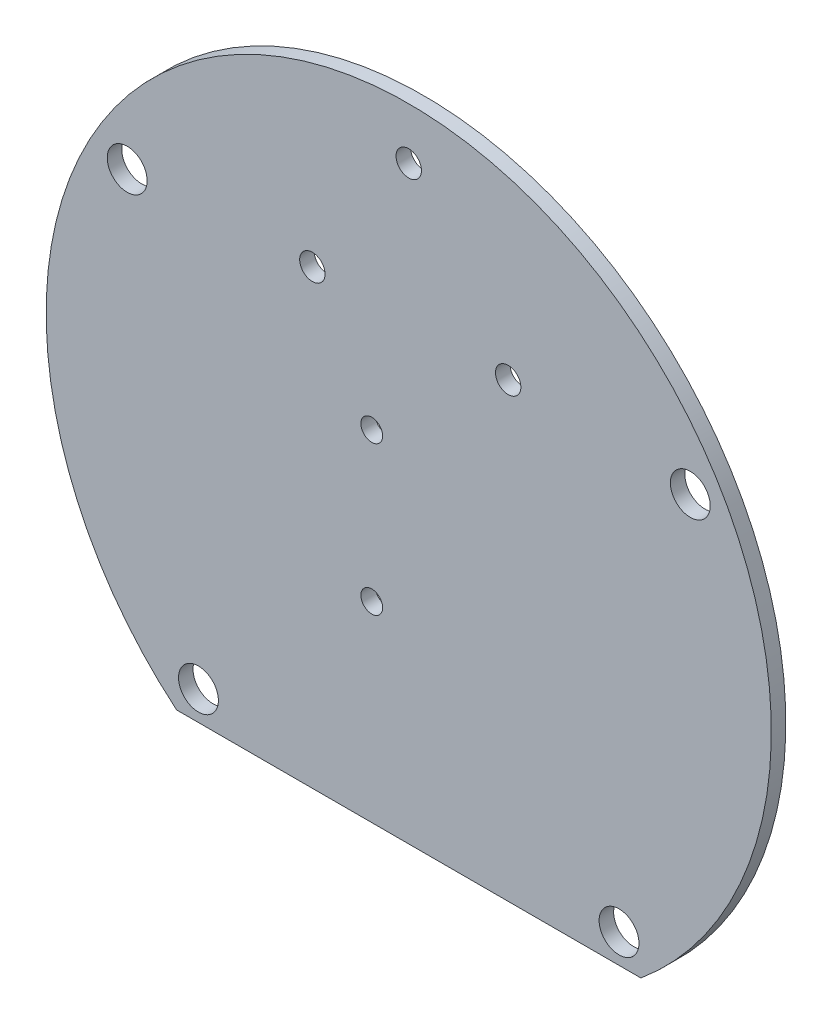
ISO-10303-21;
HEADER;
FILE_DESCRIPTION(('STEP AP214'),'2;1');
FILE_NAME('part.step','',(''),(''),'','','');
FILE_SCHEMA(('AUTOMOTIVE_DESIGN { 1 0 10303 214 1 1 1 1 }'));
ENDSEC;
DATA;
#1=APPLICATION_CONTEXT('core data for automotive mechanical design processes');
#2=APPLICATION_PROTOCOL_DEFINITION('international standard','automotive_design',2000,#1);
#3=PRODUCT_CONTEXT('',#1,'mechanical');
#4=PRODUCT('Part','Part','',(#3));
#5=PRODUCT_RELATED_PRODUCT_CATEGORY('part','',(#4));
#6=PRODUCT_DEFINITION_FORMATION('','',#4);
#7=PRODUCT_DEFINITION_CONTEXT('part definition',#1,'design');
#8=PRODUCT_DEFINITION('design','',#6,#7);
#9=PRODUCT_DEFINITION_SHAPE('','',#8);
#10=(LENGTH_UNIT() NAMED_UNIT(*) SI_UNIT(.MILLI.,.METRE.));
#11=(NAMED_UNIT(*) PLANE_ANGLE_UNIT() SI_UNIT($,.RADIAN.));
#12=(NAMED_UNIT(*) SI_UNIT($,.STERADIAN.) SOLID_ANGLE_UNIT());
#13=UNCERTAINTY_MEASURE_WITH_UNIT(LENGTH_MEASURE(1.E-05),#10,'distance_accuracy_value','');
#14=(GEOMETRIC_REPRESENTATION_CONTEXT(3) GLOBAL_UNCERTAINTY_ASSIGNED_CONTEXT((#13)) GLOBAL_UNIT_ASSIGNED_CONTEXT((#10,
#11,#12)) REPRESENTATION_CONTEXT('',''));
#15=CARTESIAN_POINT('',(0.,0.,0.));
#16=DIRECTION('',(0.,0.,1.));
#17=DIRECTION('',(1.,0.,0.));
#18=AXIS2_PLACEMENT_3D('',#15,#16,#17);
#19=CARTESIAN_POINT('',(0.,0.,2.));
#20=DIRECTION('',(0.,0.,-1.));
#21=DIRECTION('',(-1.,0.,0.));
#22=AXIS2_PLACEMENT_3D('',#19,#20,#21);
#23=CYLINDRICAL_SURFACE('',#22,50.);
#24=DIRECTION('',(0.,0.,-1.));
#25=VECTOR('',#24,1.);
#26=CARTESIAN_POINT('',(-32.0113353588168,-38.4093010681705,2.));
#27=LINE('',#26,#25);
#28=CARTESIAN_POINT('',(-32.0113353588168,-38.4093010681705,2.));
#29=VERTEX_POINT('',#28);
#30=CARTESIAN_POINT('',(-32.0113353588168,-38.4093010681705,0.));
#31=VERTEX_POINT('',#30);
#32=EDGE_CURVE('E55',#29,#31,#27,.T.);
#33=ORIENTED_EDGE('',*,*,#32,.F.);
#34=CARTESIAN_POINT('',(0.,0.,2.));
#35=DIRECTION('',(0.,0.,1.));
#36=DIRECTION('',(1.,0.,0.));
#37=AXIS2_PLACEMENT_3D('',#34,#35,#36);
#38=CIRCLE('',#37,50.);
#39=CARTESIAN_POINT('',(32.0113353588168,-38.4093010681705,2.));
#40=VERTEX_POINT('',#39);
#41=EDGE_CURVE('E49',#40,#29,#38,.T.);
#42=ORIENTED_EDGE('',*,*,#41,.F.);
#43=DIRECTION('',(0.,0.,-1.));
#44=VECTOR('',#43,1.);
#45=CARTESIAN_POINT('',(32.0113353588168,-38.4093010681705,2.));
#46=LINE('',#45,#44);
#47=CARTESIAN_POINT('',(32.0113353588168,-38.4093010681705,0.));
#48=VERTEX_POINT('',#47);
#49=EDGE_CURVE('E66',#48,#40,#46,.F.);
#50=ORIENTED_EDGE('',*,*,#49,.F.);
#51=CARTESIAN_POINT('',(0.,0.,0.));
#52=DIRECTION('',(0.,0.,1.));
#53=DIRECTION('',(1.,0.,0.));
#54=AXIS2_PLACEMENT_3D('',#51,#52,#53);
#55=CIRCLE('',#54,50.);
#56=EDGE_CURVE('E72',#48,#31,#55,.T.);
#57=ORIENTED_EDGE('',*,*,#56,.T.);
#58=EDGE_LOOP('',(#33,#42,#50,#57));
#59=FACE_BOUND('',#58,.T.);
#60=ADVANCED_FACE('F41',(#59),#23,.T.);
#61=CARTESIAN_POINT('',(0.,0.,2.));
#62=DIRECTION('',(0.,0.,1.));
#63=DIRECTION('',(1.,0.,0.));
#64=AXIS2_PLACEMENT_3D('',#61,#62,#63);
#65=PLANE('',#64);
#66=CARTESIAN_POINT('',(-5.09999999999999,-12.,2.));
#67=DIRECTION('',(0.,0.,1.));
#68=DIRECTION('',(1.,0.,0.));
#69=AXIS2_PLACEMENT_3D('',#66,#67,#68);
#70=CIRCLE('',#69,1.5);
#71=CARTESIAN_POINT('',(-3.59999999999999,-12.,2.));
#72=VERTEX_POINT('',#71);
#73=EDGE_CURVE('E75',#72,#72,#70,.T.);
#74=ORIENTED_EDGE('',*,*,#73,.F.);
#75=EDGE_LOOP('',(#74));
#76=FACE_BOUND('',#75,.T.);
#77=CARTESIAN_POINT('',(13.71,23.86,2.));
#78=DIRECTION('',(0.,0.,1.));
#79=DIRECTION('',(1.,0.,0.));
#80=AXIS2_PLACEMENT_3D('',#77,#78,#79);
#81=CIRCLE('',#80,1.75);
#82=CARTESIAN_POINT('',(15.46,23.86,2.));
#83=VERTEX_POINT('',#82);
#84=EDGE_CURVE('E121',#83,#83,#81,.T.);
#85=ORIENTED_EDGE('',*,*,#84,.F.);
#86=EDGE_LOOP('',(#85));
#87=FACE_BOUND('',#86,.T.);
#88=CARTESIAN_POINT('',(-13.29,23.86,2.));
#89=DIRECTION('',(0.,0.,1.));
#90=DIRECTION('',(1.,0.,0.));
#91=AXIS2_PLACEMENT_3D('',#88,#89,#90);
#92=CIRCLE('',#91,1.75);
#93=CARTESIAN_POINT('',(-11.54,23.86,2.));
#94=VERTEX_POINT('',#93);
#95=EDGE_CURVE('E125',#94,#94,#92,.T.);
#96=ORIENTED_EDGE('',*,*,#95,.F.);
#97=EDGE_LOOP('',(#96));
#98=FACE_BOUND('',#97,.T.);
#99=CARTESIAN_POINT('',(0.,42.87,2.));
#100=DIRECTION('',(0.,0.,1.));
#101=DIRECTION('',(1.,0.,0.));
#102=AXIS2_PLACEMENT_3D('',#99,#100,#101);
#103=CIRCLE('',#102,1.75);
#104=CARTESIAN_POINT('',(1.75,42.87,2.));
#105=VERTEX_POINT('',#104);
#106=EDGE_CURVE('E129',#105,#105,#103,.T.);
#107=ORIENTED_EDGE('',*,*,#106,.F.);
#108=EDGE_LOOP('',(#107));
#109=FACE_BOUND('',#108,.T.);
#110=CARTESIAN_POINT('',(-5.09999999999999,8.49999999999999,2.));
#111=DIRECTION('',(0.,0.,1.));
#112=DIRECTION('',(1.,0.,0.));
#113=AXIS2_PLACEMENT_3D('',#110,#111,#112);
#114=CIRCLE('',#113,1.5);
#115=CARTESIAN_POINT('',(-3.59999999999999,8.49999999999999,2.));
#116=VERTEX_POINT('',#115);
#117=EDGE_CURVE('E133',#116,#116,#114,.T.);
#118=ORIENTED_EDGE('',*,*,#117,.F.);
#119=EDGE_LOOP('',(#118));
#120=FACE_BOUND('',#119,.T.);
#121=CARTESIAN_POINT('',(38.8241975308642,22.7526193235952,2.));
#122=DIRECTION('',(0.,0.,1.));
#123=DIRECTION('',(1.,0.,0.));
#124=AXIS2_PLACEMENT_3D('',#121,#122,#123);
#125=CIRCLE('',#124,2.75);
#126=CARTESIAN_POINT('',(41.5741975308642,22.7526193235952,2.));
#127=VERTEX_POINT('',#126);
#128=EDGE_CURVE('E91',#127,#127,#125,.T.);
#129=ORIENTED_EDGE('',*,*,#128,.F.);
#130=EDGE_LOOP('',(#129));
#131=FACE_BOUND('',#130,.T.);
#132=CARTESIAN_POINT('',(-38.8241975308642,22.7526193235952,2.));
#133=DIRECTION('',(0.,0.,1.));
#134=DIRECTION('',(1.,0.,0.));
#135=AXIS2_PLACEMENT_3D('',#132,#133,#134);
#136=CIRCLE('',#135,2.75);
#137=CARTESIAN_POINT('',(-36.0741975308642,22.7526193235952,2.));
#138=VERTEX_POINT('',#137);
#139=EDGE_CURVE('E99',#138,#138,#136,.T.);
#140=ORIENTED_EDGE('',*,*,#139,.F.);
#141=EDGE_LOOP('',(#140));
#142=FACE_BOUND('',#141,.T.);
#143=CARTESIAN_POINT('',(29.,-34.4093010681705,2.));
#144=DIRECTION('',(0.,0.,1.));
#145=DIRECTION('',(1.,0.,0.));
#146=AXIS2_PLACEMENT_3D('',#143,#144,#145);
#147=CIRCLE('',#146,2.75);
#148=CARTESIAN_POINT('',(31.75,-34.4093010681705,2.));
#149=VERTEX_POINT('',#148);
#150=EDGE_CURVE('E107',#149,#149,#147,.T.);
#151=ORIENTED_EDGE('',*,*,#150,.F.);
#152=EDGE_LOOP('',(#151));
#153=FACE_BOUND('',#152,.T.);
#154=CARTESIAN_POINT('',(-29.,-34.4093010681705,2.));
#155=DIRECTION('',(0.,0.,1.));
#156=DIRECTION('',(1.,0.,0.));
#157=AXIS2_PLACEMENT_3D('',#154,#155,#156);
#158=CIRCLE('',#157,2.75);
#159=CARTESIAN_POINT('',(-26.25,-34.4093010681705,2.));
#160=VERTEX_POINT('',#159);
#161=EDGE_CURVE('E84',#160,#160,#158,.T.);
#162=ORIENTED_EDGE('',*,*,#161,.F.);
#163=EDGE_LOOP('',(#162));
#164=FACE_BOUND('',#163,.T.);
#165=ORIENTED_EDGE('',*,*,#41,.T.);
#166=DIRECTION('',(1.,0.,0.));
#167=VECTOR('',#166,1.);
#168=CARTESIAN_POINT('',(0.,-38.4093010681705,2.));
#169=LINE('',#168,#167);
#170=EDGE_CURVE('E60',#29,#40,#169,.T.);
#171=ORIENTED_EDGE('',*,*,#170,.T.);
#172=EDGE_LOOP('',(#165,#171));
#173=FACE_BOUND('',#172,.T.);
#174=ADVANCED_FACE('F163',(#76,#87,#98,#109,#120,#131,#142,#153,#164,#173),#65,.T.);
#175=CARTESIAN_POINT('',(0.,0.,0.));
#176=DIRECTION('',(0.,0.,1.));
#177=DIRECTION('',(1.,0.,0.));
#178=AXIS2_PLACEMENT_3D('',#175,#176,#177);
#179=PLANE('',#178);
#180=CARTESIAN_POINT('',(-5.09999999999999,-12.,0.));
#181=DIRECTION('',(0.,0.,-1.));
#182=DIRECTION('',(-1.,0.,0.));
#183=AXIS2_PLACEMENT_3D('',#180,#181,#182);
#184=CIRCLE('',#183,1.5);
#185=CARTESIAN_POINT('',(-6.59999999999999,-12.,0.));
#186=VERTEX_POINT('',#185);
#187=EDGE_CURVE('E141',#186,#186,#184,.T.);
#188=ORIENTED_EDGE('',*,*,#187,.F.);
#189=EDGE_LOOP('',(#188));
#190=FACE_BOUND('',#189,.T.);
#191=CARTESIAN_POINT('',(13.71,23.86,0.));
#192=DIRECTION('',(0.,0.,-1.));
#193=DIRECTION('',(-1.,0.,0.));
#194=AXIS2_PLACEMENT_3D('',#191,#192,#193);
#195=CIRCLE('',#194,1.75);
#196=CARTESIAN_POINT('',(11.96,23.86,0.));
#197=VERTEX_POINT('',#196);
#198=EDGE_CURVE('E142',#197,#197,#195,.T.);
#199=ORIENTED_EDGE('',*,*,#198,.F.);
#200=EDGE_LOOP('',(#199));
#201=FACE_BOUND('',#200,.T.);
#202=CARTESIAN_POINT('',(-13.29,23.86,0.));
#203=DIRECTION('',(0.,0.,-1.));
#204=DIRECTION('',(-1.,0.,0.));
#205=AXIS2_PLACEMENT_3D('',#202,#203,#204);
#206=CIRCLE('',#205,1.75);
#207=CARTESIAN_POINT('',(-15.04,23.86,0.));
#208=VERTEX_POINT('',#207);
#209=EDGE_CURVE('E146',#208,#208,#206,.T.);
#210=ORIENTED_EDGE('',*,*,#209,.F.);
#211=EDGE_LOOP('',(#210));
#212=FACE_BOUND('',#211,.T.);
#213=CARTESIAN_POINT('',(0.,42.87,0.));
#214=DIRECTION('',(0.,0.,-1.));
#215=DIRECTION('',(-1.,0.,0.));
#216=AXIS2_PLACEMENT_3D('',#213,#214,#215);
#217=CIRCLE('',#216,1.75);
#218=CARTESIAN_POINT('',(-1.75,42.87,0.));
#219=VERTEX_POINT('',#218);
#220=EDGE_CURVE('E150',#219,#219,#217,.T.);
#221=ORIENTED_EDGE('',*,*,#220,.F.);
#222=EDGE_LOOP('',(#221));
#223=FACE_BOUND('',#222,.T.);
#224=CARTESIAN_POINT('',(-5.09999999999999,8.49999999999999,0.));
#225=DIRECTION('',(0.,0.,-1.));
#226=DIRECTION('',(-1.,0.,0.));
#227=AXIS2_PLACEMENT_3D('',#224,#225,#226);
#228=CIRCLE('',#227,1.5);
#229=CARTESIAN_POINT('',(-6.59999999999999,8.49999999999999,0.));
#230=VERTEX_POINT('',#229);
#231=EDGE_CURVE('E137',#230,#230,#228,.T.);
#232=ORIENTED_EDGE('',*,*,#231,.F.);
#233=EDGE_LOOP('',(#232));
#234=FACE_BOUND('',#233,.T.);
#235=CARTESIAN_POINT('',(-29.,-34.4093010681705,0.));
#236=DIRECTION('',(0.,0.,1.));
#237=DIRECTION('',(1.,0.,0.));
#238=AXIS2_PLACEMENT_3D('',#235,#236,#237);
#239=CIRCLE('',#238,2.75);
#240=CARTESIAN_POINT('',(-26.25,-34.4093010681705,0.));
#241=VERTEX_POINT('',#240);
#242=EDGE_CURVE('E79',#241,#241,#239,.T.);
#243=ORIENTED_EDGE('',*,*,#242,.T.);
#244=EDGE_LOOP('',(#243));
#245=FACE_BOUND('',#244,.T.);
#246=CARTESIAN_POINT('',(29.,-34.4093010681705,0.));
#247=DIRECTION('',(0.,0.,1.));
#248=DIRECTION('',(1.,0.,0.));
#249=AXIS2_PLACEMENT_3D('',#246,#247,#248);
#250=CIRCLE('',#249,2.75);
#251=CARTESIAN_POINT('',(31.75,-34.4093010681705,0.));
#252=VERTEX_POINT('',#251);
#253=EDGE_CURVE('E89',#252,#252,#250,.T.);
#254=ORIENTED_EDGE('',*,*,#253,.T.);
#255=EDGE_LOOP('',(#254));
#256=FACE_BOUND('',#255,.T.);
#257=CARTESIAN_POINT('',(-38.8241975308642,22.7526193235952,0.));
#258=DIRECTION('',(0.,0.,1.));
#259=DIRECTION('',(1.,0.,0.));
#260=AXIS2_PLACEMENT_3D('',#257,#258,#259);
#261=CIRCLE('',#260,2.75);
#262=CARTESIAN_POINT('',(-36.0741975308642,22.7526193235952,0.));
#263=VERTEX_POINT('',#262);
#264=EDGE_CURVE('E103',#263,#263,#261,.T.);
#265=ORIENTED_EDGE('',*,*,#264,.T.);
#266=EDGE_LOOP('',(#265));
#267=FACE_BOUND('',#266,.T.);
#268=CARTESIAN_POINT('',(38.8241975308642,22.7526193235952,0.));
#269=DIRECTION('',(0.,0.,1.));
#270=DIRECTION('',(1.,0.,0.));
#271=AXIS2_PLACEMENT_3D('',#268,#269,#270);
#272=CIRCLE('',#271,2.75);
#273=CARTESIAN_POINT('',(41.5741975308642,22.7526193235952,0.));
#274=VERTEX_POINT('',#273);
#275=EDGE_CURVE('E95',#274,#274,#272,.T.);
#276=ORIENTED_EDGE('',*,*,#275,.T.);
#277=EDGE_LOOP('',(#276));
#278=FACE_BOUND('',#277,.T.);
#279=DIRECTION('',(1.,0.,0.));
#280=VECTOR('',#279,1.);
#281=CARTESIAN_POINT('',(0.,-38.4093010681705,0.));
#282=LINE('',#281,#280);
#283=EDGE_CURVE('E11',#31,#48,#282,.T.);
#284=ORIENTED_EDGE('',*,*,#283,.F.);
#285=ORIENTED_EDGE('',*,*,#56,.F.);
#286=EDGE_LOOP('',(#284,#285));
#287=FACE_BOUND('',#286,.T.);
#288=ADVANCED_FACE('F77',(#190,#201,#212,#223,#234,#245,#256,#267,#278,#287),#179,.F.);
#289=CARTESIAN_POINT('',(-29.,-34.4093010681705,0.));
#290=DIRECTION('',(0.,0.,1.));
#291=DIRECTION('',(1.,0.,0.));
#292=AXIS2_PLACEMENT_3D('',#289,#290,#291);
#293=CYLINDRICAL_SURFACE('',#292,2.75);
#294=ORIENTED_EDGE('',*,*,#242,.F.);
#295=EDGE_LOOP('',(#294));
#296=FACE_BOUND('',#295,.T.);
#297=ORIENTED_EDGE('',*,*,#161,.T.);
#298=EDGE_LOOP('',(#297));
#299=FACE_BOUND('',#298,.T.);
#300=ADVANCED_FACE('F162',(#296,#299),#293,.F.);
#301=CARTESIAN_POINT('',(29.,-34.4093010681705,0.));
#302=DIRECTION('',(0.,0.,1.));
#303=DIRECTION('',(1.,0.,0.));
#304=AXIS2_PLACEMENT_3D('',#301,#302,#303);
#305=CYLINDRICAL_SURFACE('',#304,2.75);
#306=ORIENTED_EDGE('',*,*,#253,.F.);
#307=EDGE_LOOP('',(#306));
#308=FACE_BOUND('',#307,.T.);
#309=ORIENTED_EDGE('',*,*,#150,.T.);
#310=EDGE_LOOP('',(#309));
#311=FACE_BOUND('',#310,.T.);
#312=ADVANCED_FACE('F196',(#308,#311),#305,.F.);
#313=CARTESIAN_POINT('',(-38.8241975308642,22.7526193235952,0.));
#314=DIRECTION('',(0.,0.,1.));
#315=DIRECTION('',(1.,0.,0.));
#316=AXIS2_PLACEMENT_3D('',#313,#314,#315);
#317=CYLINDRICAL_SURFACE('',#316,2.75);
#318=ORIENTED_EDGE('',*,*,#264,.F.);
#319=EDGE_LOOP('',(#318));
#320=FACE_BOUND('',#319,.T.);
#321=ORIENTED_EDGE('',*,*,#139,.T.);
#322=EDGE_LOOP('',(#321));
#323=FACE_BOUND('',#322,.T.);
#324=ADVANCED_FACE('F180',(#320,#323),#317,.F.);
#325=CARTESIAN_POINT('',(38.8241975308642,22.7526193235952,0.));
#326=DIRECTION('',(0.,0.,1.));
#327=DIRECTION('',(1.,0.,0.));
#328=AXIS2_PLACEMENT_3D('',#325,#326,#327);
#329=CYLINDRICAL_SURFACE('',#328,2.75);
#330=ORIENTED_EDGE('',*,*,#275,.F.);
#331=EDGE_LOOP('',(#330));
#332=FACE_BOUND('',#331,.T.);
#333=ORIENTED_EDGE('',*,*,#128,.T.);
#334=EDGE_LOOP('',(#333));
#335=FACE_BOUND('',#334,.T.);
#336=ADVANCED_FACE('F177',(#332,#335),#329,.F.);
#337=CARTESIAN_POINT('',(-40.7238599785686,-38.4093010681705,2.000012));
#338=DIRECTION('',(0.,-1.,0.));
#339=DIRECTION('',(0.,0.,-1.));
#340=AXIS2_PLACEMENT_3D('',#337,#338,#339);
#341=PLANE('',#340);
#342=ORIENTED_EDGE('',*,*,#32,.T.);
#343=ORIENTED_EDGE('',*,*,#283,.T.);
#344=ORIENTED_EDGE('',*,*,#49,.T.);
#345=ORIENTED_EDGE('',*,*,#170,.F.);
#346=EDGE_LOOP('',(#342,#343,#344,#345));
#347=FACE_BOUND('',#346,.T.);
#348=ADVANCED_FACE('F65',(#347),#341,.T.);
#349=CARTESIAN_POINT('',(-5.09999999999999,8.49999999999999,10.));
#350=DIRECTION('',(0.,0.,-1.));
#351=DIRECTION('',(-1.,0.,0.));
#352=AXIS2_PLACEMENT_3D('',#349,#350,#351);
#353=CYLINDRICAL_SURFACE('',#352,1.5);
#354=ORIENTED_EDGE('',*,*,#117,.T.);
#355=EDGE_LOOP('',(#354));
#356=FACE_BOUND('',#355,.T.);
#357=ORIENTED_EDGE('',*,*,#231,.T.);
#358=EDGE_LOOP('',(#357));
#359=FACE_BOUND('',#358,.T.);
#360=ADVANCED_FACE('F224',(#356,#359),#353,.F.);
#361=CARTESIAN_POINT('',(0.,42.87,10.));
#362=DIRECTION('',(0.,0.,-1.));
#363=DIRECTION('',(-1.,0.,0.));
#364=AXIS2_PLACEMENT_3D('',#361,#362,#363);
#365=CYLINDRICAL_SURFACE('',#364,1.75);
#366=ORIENTED_EDGE('',*,*,#106,.T.);
#367=EDGE_LOOP('',(#366));
#368=FACE_BOUND('',#367,.T.);
#369=ORIENTED_EDGE('',*,*,#220,.T.);
#370=EDGE_LOOP('',(#369));
#371=FACE_BOUND('',#370,.T.);
#372=ADVANCED_FACE('F235',(#368,#371),#365,.F.);
#373=CARTESIAN_POINT('',(-13.29,23.86,10.));
#374=DIRECTION('',(0.,0.,-1.));
#375=DIRECTION('',(-1.,0.,0.));
#376=AXIS2_PLACEMENT_3D('',#373,#374,#375);
#377=CYLINDRICAL_SURFACE('',#376,1.75);
#378=ORIENTED_EDGE('',*,*,#95,.T.);
#379=EDGE_LOOP('',(#378));
#380=FACE_BOUND('',#379,.T.);
#381=ORIENTED_EDGE('',*,*,#209,.T.);
#382=EDGE_LOOP('',(#381));
#383=FACE_BOUND('',#382,.T.);
#384=ADVANCED_FACE('F158',(#380,#383),#377,.F.);
#385=CARTESIAN_POINT('',(13.71,23.86,10.));
#386=DIRECTION('',(0.,0.,-1.));
#387=DIRECTION('',(-1.,0.,0.));
#388=AXIS2_PLACEMENT_3D('',#385,#386,#387);
#389=CYLINDRICAL_SURFACE('',#388,1.75);
#390=ORIENTED_EDGE('',*,*,#84,.T.);
#391=EDGE_LOOP('',(#390));
#392=FACE_BOUND('',#391,.T.);
#393=ORIENTED_EDGE('',*,*,#198,.T.);
#394=EDGE_LOOP('',(#393));
#395=FACE_BOUND('',#394,.T.);
#396=ADVANCED_FACE('F250',(#392,#395),#389,.F.);
#397=CARTESIAN_POINT('',(-5.09999999999999,-12.,10.));
#398=DIRECTION('',(0.,0.,-1.));
#399=DIRECTION('',(-1.,0.,0.));
#400=AXIS2_PLACEMENT_3D('',#397,#398,#399);
#401=CYLINDRICAL_SURFACE('',#400,1.5);
#402=ORIENTED_EDGE('',*,*,#73,.T.);
#403=EDGE_LOOP('',(#402));
#404=FACE_BOUND('',#403,.T.);
#405=ORIENTED_EDGE('',*,*,#187,.T.);
#406=EDGE_LOOP('',(#405));
#407=FACE_BOUND('',#406,.T.);
#408=ADVANCED_FACE('F258',(#404,#407),#401,.F.);
#409=CLOSED_SHELL('',(#60,#174,#288,#300,#312,#324,#336,#348,#360,#372,#384,#396,#408));
#410=MANIFOLD_SOLID_BREP('B2',#409);
#411=ADVANCED_BREP_SHAPE_REPRESENTATION('',(#18,#410),#14);
#412=SHAPE_DEFINITION_REPRESENTATION(#9,#411);
ENDSEC;
END-ISO-10303-21;
